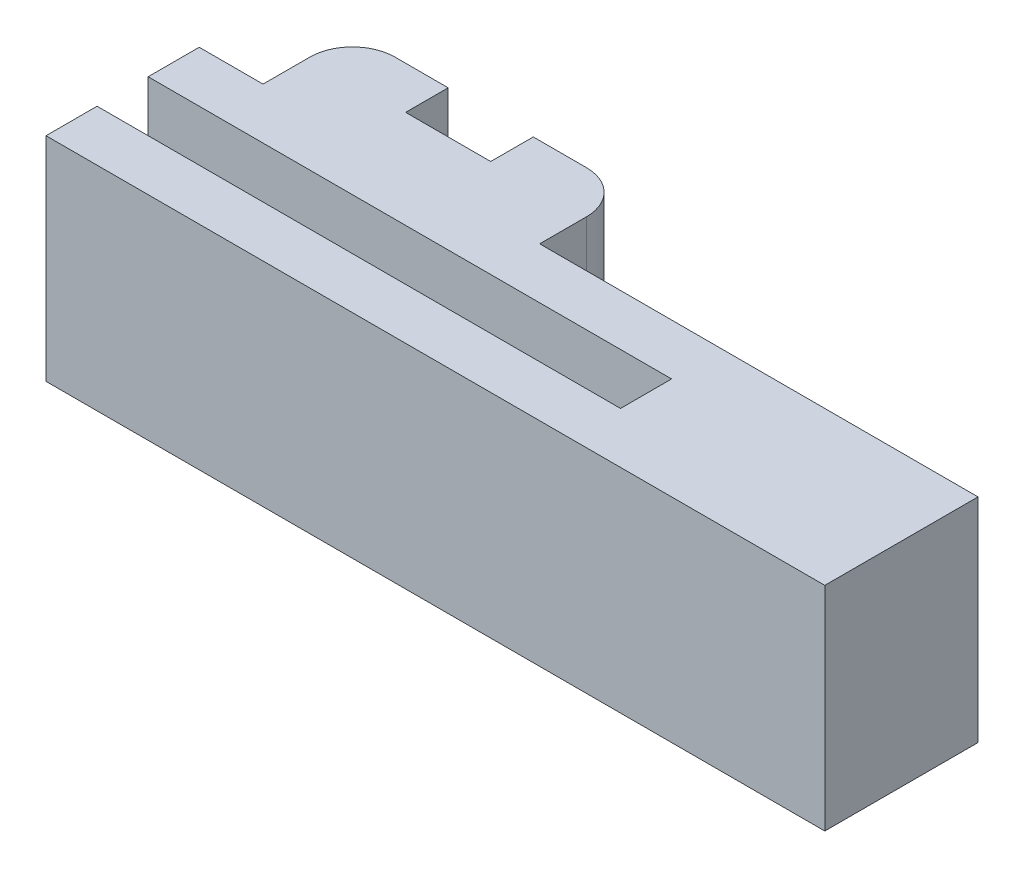
ISO-10303-21;
HEADER;
FILE_DESCRIPTION(('STEP AP214'),'2;1');
FILE_NAME('part.step','',(''),(''),'','','');
FILE_SCHEMA(('AUTOMOTIVE_DESIGN { 1 0 10303 214 1 1 1 1 }'));
ENDSEC;
DATA;
#1=APPLICATION_CONTEXT('core data for automotive mechanical design processes');
#2=APPLICATION_PROTOCOL_DEFINITION('international standard','automotive_design',2000,#1);
#3=PRODUCT_CONTEXT('',#1,'mechanical');
#4=PRODUCT('Part','Part','',(#3));
#5=PRODUCT_RELATED_PRODUCT_CATEGORY('part','',(#4));
#6=PRODUCT_DEFINITION_FORMATION('','',#4);
#7=PRODUCT_DEFINITION_CONTEXT('part definition',#1,'design');
#8=PRODUCT_DEFINITION('design','',#6,#7);
#9=PRODUCT_DEFINITION_SHAPE('','',#8);
#10=(LENGTH_UNIT() NAMED_UNIT(*) SI_UNIT(.MILLI.,.METRE.));
#11=(NAMED_UNIT(*) PLANE_ANGLE_UNIT() SI_UNIT($,.RADIAN.));
#12=(NAMED_UNIT(*) SI_UNIT($,.STERADIAN.) SOLID_ANGLE_UNIT());
#13=UNCERTAINTY_MEASURE_WITH_UNIT(LENGTH_MEASURE(1.E-05),#10,'distance_accuracy_value','');
#14=(GEOMETRIC_REPRESENTATION_CONTEXT(3) GLOBAL_UNCERTAINTY_ASSIGNED_CONTEXT((#13)) GLOBAL_UNIT_ASSIGNED_CONTEXT((#10,
#11,#12)) REPRESENTATION_CONTEXT('',''));
#15=CARTESIAN_POINT('',(0.,0.,0.));
#16=DIRECTION('',(0.,0.,1.));
#17=DIRECTION('',(1.,0.,0.));
#18=AXIS2_PLACEMENT_3D('',#15,#16,#17);
#19=CARTESIAN_POINT('',(-14.5036363636364,5.,-2.06181818181818));
#20=DIRECTION('',(1.,0.,0.));
#21=DIRECTION('',(0.,0.,-1.));
#22=AXIS2_PLACEMENT_3D('',#19,#20,#21);
#23=PLANE('',#22);
#24=DIRECTION('',(0.,0.,1.));
#25=VECTOR('',#24,1.);
#26=CARTESIAN_POINT('',(-14.5036363636364,0.,-2.06181818181818));
#27=LINE('',#26,#25);
#28=CARTESIAN_POINT('',(-14.5036363636364,0.,-2.06181818181818));
#29=VERTEX_POINT('',#28);
#30=CARTESIAN_POINT('',(-14.5036363636364,0.,-0.861818181818182));
#31=VERTEX_POINT('',#30);
#32=EDGE_CURVE('E192',#29,#31,#27,.T.);
#33=ORIENTED_EDGE('',*,*,#32,.T.);
#34=DIRECTION('',(0.,-1.,0.));
#35=VECTOR('',#34,1.);
#36=CARTESIAN_POINT('',(-14.5036363636364,5.,-0.861818181818182));
#37=LINE('',#36,#35);
#38=CARTESIAN_POINT('',(-14.5036363636364,5.,-0.861818181818182));
#39=VERTEX_POINT('',#38);
#40=EDGE_CURVE('E173',#39,#31,#37,.T.);
#41=ORIENTED_EDGE('',*,*,#40,.F.);
#42=DIRECTION('',(0.,0.,1.));
#43=VECTOR('',#42,1.);
#44=CARTESIAN_POINT('',(-14.5036363636364,5.,-2.06181818181818));
#45=LINE('',#44,#43);
#46=CARTESIAN_POINT('',(-14.5036363636364,5.,-2.06181818181818));
#47=VERTEX_POINT('',#46);
#48=EDGE_CURVE('E179',#47,#39,#45,.T.);
#49=ORIENTED_EDGE('',*,*,#48,.F.);
#50=DIRECTION('',(0.,-1.,0.));
#51=VECTOR('',#50,1.);
#52=CARTESIAN_POINT('',(-14.5036363636364,5.,-2.06181818181818));
#53=LINE('',#52,#51);
#54=EDGE_CURVE('E234',#47,#29,#53,.T.);
#55=ORIENTED_EDGE('',*,*,#54,.T.);
#56=EDGE_LOOP('',(#33,#41,#49,#55));
#57=FACE_BOUND('',#56,.T.);
#58=ADVANCED_FACE('F41',(#57),#23,.F.);
#59=CARTESIAN_POINT('',(-14.5036363636364,5.,-0.861818181818182));
#60=DIRECTION('',(0.,0.,-1.));
#61=DIRECTION('',(-1.,0.,0.));
#62=AXIS2_PLACEMENT_3D('',#59,#60,#61);
#63=PLANE('',#62);
#64=DIRECTION('',(1.,0.,0.));
#65=VECTOR('',#64,1.);
#66=CARTESIAN_POINT('',(-14.5036363636364,0.,-0.861818181818182));
#67=LINE('',#66,#65);
#68=CARTESIAN_POINT('',(-2.20363636363636,0.,-0.861818181818182));
#69=VERTEX_POINT('',#68);
#70=EDGE_CURVE('E284',#31,#69,#67,.T.);
#71=ORIENTED_EDGE('',*,*,#70,.T.);
#72=DIRECTION('',(0.,-1.,0.));
#73=VECTOR('',#72,1.);
#74=CARTESIAN_POINT('',(-2.20363636363636,5.,-0.861818181818182));
#75=LINE('',#74,#73);
#76=CARTESIAN_POINT('',(-2.20363636363636,5.,-0.861818181818182));
#77=VERTEX_POINT('',#76);
#78=EDGE_CURVE('E176',#77,#69,#75,.T.);
#79=ORIENTED_EDGE('',*,*,#78,.F.);
#80=DIRECTION('',(1.,0.,0.));
#81=VECTOR('',#80,1.);
#82=CARTESIAN_POINT('',(-14.5036363636364,5.,-0.861818181818182));
#83=LINE('',#82,#81);
#84=EDGE_CURVE('E169',#39,#77,#83,.T.);
#85=ORIENTED_EDGE('',*,*,#84,.F.);
#86=ORIENTED_EDGE('',*,*,#40,.T.);
#87=EDGE_LOOP('',(#71,#79,#85,#86));
#88=FACE_BOUND('',#87,.T.);
#89=ADVANCED_FACE('F171',(#88),#63,.F.);
#90=CARTESIAN_POINT('',(-2.20363636363636,5.,-0.861818181818182));
#91=DIRECTION('',(1.,0.,0.));
#92=DIRECTION('',(0.,0.,-1.));
#93=AXIS2_PLACEMENT_3D('',#90,#91,#92);
#94=PLANE('',#93);
#95=DIRECTION('',(0.,0.,1.));
#96=VECTOR('',#95,1.);
#97=CARTESIAN_POINT('',(-2.20363636363636,0.,-0.861818181818182));
#98=LINE('',#97,#96);
#99=CARTESIAN_POINT('',(-2.20363636363636,0.,0.338181818181818));
#100=VERTEX_POINT('',#99);
#101=EDGE_CURVE('E278',#69,#100,#98,.T.);
#102=ORIENTED_EDGE('',*,*,#101,.T.);
#103=DIRECTION('',(0.,-1.,0.));
#104=VECTOR('',#103,1.);
#105=CARTESIAN_POINT('',(-2.20363636363636,5.,0.338181818181818));
#106=LINE('',#105,#104);
#107=CARTESIAN_POINT('',(-2.20363636363636,5.,0.338181818181818));
#108=VERTEX_POINT('',#107);
#109=EDGE_CURVE('E198',#108,#100,#106,.T.);
#110=ORIENTED_EDGE('',*,*,#109,.F.);
#111=DIRECTION('',(0.,0.,1.));
#112=VECTOR('',#111,1.);
#113=CARTESIAN_POINT('',(-2.20363636363636,5.,-0.861818181818182));
#114=LINE('',#113,#112);
#115=EDGE_CURVE('E178',#77,#108,#114,.T.);
#116=ORIENTED_EDGE('',*,*,#115,.F.);
#117=ORIENTED_EDGE('',*,*,#78,.T.);
#118=EDGE_LOOP('',(#102,#110,#116,#117));
#119=FACE_BOUND('',#118,.T.);
#120=ADVANCED_FACE('F321',(#119),#94,.F.);
#121=CARTESIAN_POINT('',(-14.5036363636364,5.,0.338181818181818));
#122=DIRECTION('',(0.,0.,1.));
#123=DIRECTION('',(1.,0.,0.));
#124=AXIS2_PLACEMENT_3D('',#121,#122,#123);
#125=PLANE('',#124);
#126=DIRECTION('',(-1.,0.,0.));
#127=VECTOR('',#126,1.);
#128=CARTESIAN_POINT('',(-14.5036363636364,0.,0.338181818181818));
#129=LINE('',#128,#127);
#130=CARTESIAN_POINT('',(-14.5036363636364,0.,0.338181818181818));
#131=VERTEX_POINT('',#130);
#132=EDGE_CURVE('E273',#100,#131,#129,.T.);
#133=ORIENTED_EDGE('',*,*,#132,.T.);
#134=DIRECTION('',(0.,-1.,0.));
#135=VECTOR('',#134,1.);
#136=CARTESIAN_POINT('',(-14.5036363636364,5.,0.338181818181818));
#137=LINE('',#136,#135);
#138=CARTESIAN_POINT('',(-14.5036363636364,5.,0.338181818181818));
#139=VERTEX_POINT('',#138);
#140=EDGE_CURVE('E264',#139,#131,#137,.T.);
#141=ORIENTED_EDGE('',*,*,#140,.F.);
#142=DIRECTION('',(-1.,0.,0.));
#143=VECTOR('',#142,1.);
#144=CARTESIAN_POINT('',(-14.5036363636364,5.,0.338181818181818));
#145=LINE('',#144,#143);
#146=EDGE_CURVE('E274',#108,#139,#145,.T.);
#147=ORIENTED_EDGE('',*,*,#146,.F.);
#148=ORIENTED_EDGE('',*,*,#109,.T.);
#149=EDGE_LOOP('',(#133,#141,#147,#148));
#150=FACE_BOUND('',#149,.T.);
#151=ADVANCED_FACE('F271',(#150),#125,.F.);
#152=CARTESIAN_POINT('',(-14.5036363636364,5.,0.338181818181818));
#153=DIRECTION('',(1.,0.,0.));
#154=DIRECTION('',(0.,0.,-1.));
#155=AXIS2_PLACEMENT_3D('',#152,#153,#154);
#156=PLANE('',#155);
#157=DIRECTION('',(0.,0.,1.));
#158=VECTOR('',#157,1.);
#159=CARTESIAN_POINT('',(-14.5036363636364,0.,0.338181818181818));
#160=LINE('',#159,#158);
#161=CARTESIAN_POINT('',(-14.5036363636364,0.,1.53818181818182));
#162=VERTEX_POINT('',#161);
#163=EDGE_CURVE('E280',#131,#162,#160,.T.);
#164=ORIENTED_EDGE('',*,*,#163,.T.);
#165=DIRECTION('',(0.,-1.,0.));
#166=VECTOR('',#165,1.);
#167=CARTESIAN_POINT('',(-14.5036363636364,5.,1.53818181818182));
#168=LINE('',#167,#166);
#169=CARTESIAN_POINT('',(-14.5036363636364,5.,1.53818181818182));
#170=VERTEX_POINT('',#169);
#171=EDGE_CURVE('E261',#170,#162,#168,.T.);
#172=ORIENTED_EDGE('',*,*,#171,.F.);
#173=DIRECTION('',(0.,0.,1.));
#174=VECTOR('',#173,1.);
#175=CARTESIAN_POINT('',(-14.5036363636364,5.,0.338181818181818));
#176=LINE('',#175,#174);
#177=EDGE_CURVE('E323',#139,#170,#176,.T.);
#178=ORIENTED_EDGE('',*,*,#177,.F.);
#179=ORIENTED_EDGE('',*,*,#140,.T.);
#180=EDGE_LOOP('',(#164,#172,#178,#179));
#181=FACE_BOUND('',#180,.T.);
#182=ADVANCED_FACE('F379',(#181),#156,.F.);
#183=CARTESIAN_POINT('',(-14.5036363636364,5.,1.53818181818182));
#184=DIRECTION('',(0.,0.,-1.));
#185=DIRECTION('',(-1.,0.,0.));
#186=AXIS2_PLACEMENT_3D('',#183,#184,#185);
#187=PLANE('',#186);
#188=DIRECTION('',(1.,0.,0.));
#189=VECTOR('',#188,1.);
#190=CARTESIAN_POINT('',(-14.5036363636364,0.,1.53818181818182));
#191=LINE('',#190,#189);
#192=CARTESIAN_POINT('',(3.79636363636364,0.,1.53818181818182));
#193=VERTEX_POINT('',#192);
#194=EDGE_CURVE('E282',#162,#193,#191,.T.);
#195=ORIENTED_EDGE('',*,*,#194,.T.);
#196=DIRECTION('',(0.,-1.,0.));
#197=VECTOR('',#196,1.);
#198=CARTESIAN_POINT('',(3.79636363636364,5.,1.53818181818182));
#199=LINE('',#198,#197);
#200=CARTESIAN_POINT('',(3.79636363636364,5.,1.53818181818182));
#201=VERTEX_POINT('',#200);
#202=EDGE_CURVE('E258',#201,#193,#199,.T.);
#203=ORIENTED_EDGE('',*,*,#202,.F.);
#204=DIRECTION('',(1.,0.,0.));
#205=VECTOR('',#204,1.);
#206=CARTESIAN_POINT('',(-14.5036363636364,5.,1.53818181818182));
#207=LINE('',#206,#205);
#208=EDGE_CURVE('E327',#170,#201,#207,.T.);
#209=ORIENTED_EDGE('',*,*,#208,.F.);
#210=ORIENTED_EDGE('',*,*,#171,.T.);
#211=EDGE_LOOP('',(#195,#203,#209,#210));
#212=FACE_BOUND('',#211,.T.);
#213=ADVANCED_FACE('F375',(#212),#187,.F.);
#214=CARTESIAN_POINT('',(3.79636363636364,5.,-2.06181818181818));
#215=DIRECTION('',(-1.,0.,0.));
#216=DIRECTION('',(0.,0.,1.));
#217=AXIS2_PLACEMENT_3D('',#214,#215,#216);
#218=PLANE('',#217);
#219=DIRECTION('',(0.,0.,-1.));
#220=VECTOR('',#219,1.);
#221=CARTESIAN_POINT('',(3.79636363636364,0.,-2.06181818181818));
#222=LINE('',#221,#220);
#223=CARTESIAN_POINT('',(3.79636363636364,0.,-2.06181818181818));
#224=VERTEX_POINT('',#223);
#225=EDGE_CURVE('E289',#193,#224,#222,.T.);
#226=ORIENTED_EDGE('',*,*,#225,.T.);
#227=DIRECTION('',(0.,-1.,0.));
#228=VECTOR('',#227,1.);
#229=CARTESIAN_POINT('',(3.79636363636364,5.,-2.06181818181818));
#230=LINE('',#229,#228);
#231=CARTESIAN_POINT('',(3.79636363636364,5.,-2.06181818181818));
#232=VERTEX_POINT('',#231);
#233=EDGE_CURVE('E255',#232,#224,#230,.T.);
#234=ORIENTED_EDGE('',*,*,#233,.F.);
#235=DIRECTION('',(0.,0.,-1.));
#236=VECTOR('',#235,1.);
#237=CARTESIAN_POINT('',(3.79636363636364,5.,-2.06181818181818));
#238=LINE('',#237,#236);
#239=EDGE_CURVE('E329',#201,#232,#238,.T.);
#240=ORIENTED_EDGE('',*,*,#239,.F.);
#241=ORIENTED_EDGE('',*,*,#202,.T.);
#242=EDGE_LOOP('',(#226,#234,#240,#241));
#243=FACE_BOUND('',#242,.T.);
#244=ADVANCED_FACE('F370',(#243),#218,.F.);
#245=CARTESIAN_POINT('',(-6.50363636363636,5.,-2.06181818181818));
#246=DIRECTION('',(0.,0.,1.));
#247=DIRECTION('',(1.,0.,0.));
#248=AXIS2_PLACEMENT_3D('',#245,#246,#247);
#249=PLANE('',#248);
#250=DIRECTION('',(-1.,0.,0.));
#251=VECTOR('',#250,1.);
#252=CARTESIAN_POINT('',(-6.50363636363636,0.,-2.06181818181818));
#253=LINE('',#252,#251);
#254=CARTESIAN_POINT('',(-6.50363636363636,0.,-2.06181818181818));
#255=VERTEX_POINT('',#254);
#256=EDGE_CURVE('E291',#224,#255,#253,.T.);
#257=ORIENTED_EDGE('',*,*,#256,.T.);
#258=DIRECTION('',(0.,-1.,0.));
#259=VECTOR('',#258,1.);
#260=CARTESIAN_POINT('',(-6.50363636363636,5.,-2.06181818181818));
#261=LINE('',#260,#259);
#262=CARTESIAN_POINT('',(-6.50363636363636,5.,-2.06181818181818));
#263=VERTEX_POINT('',#262);
#264=EDGE_CURVE('E251',#263,#255,#261,.T.);
#265=ORIENTED_EDGE('',*,*,#264,.F.);
#266=DIRECTION('',(-1.,0.,0.));
#267=VECTOR('',#266,1.);
#268=CARTESIAN_POINT('',(-6.50363636363636,5.,-2.06181818181818));
#269=LINE('',#268,#267);
#270=EDGE_CURVE('E331',#232,#263,#269,.T.);
#271=ORIENTED_EDGE('',*,*,#270,.F.);
#272=ORIENTED_EDGE('',*,*,#233,.T.);
#273=EDGE_LOOP('',(#257,#265,#271,#272));
#274=FACE_BOUND('',#273,.T.);
#275=ADVANCED_FACE('F366',(#274),#249,.F.);
#276=CARTESIAN_POINT('',(-6.50363636363636,5.,-2.06181818181818));
#277=DIRECTION('',(-1.,0.,0.));
#278=DIRECTION('',(0.,0.,1.));
#279=AXIS2_PLACEMENT_3D('',#276,#277,#278);
#280=PLANE('',#279);
#281=DIRECTION('',(0.,0.,-1.));
#282=VECTOR('',#281,1.);
#283=CARTESIAN_POINT('',(-6.50363636363636,0.,-2.06181818181818));
#284=LINE('',#283,#282);
#285=CARTESIAN_POINT('',(-6.50363636363636,0.,-3.16181818181818));
#286=VERTEX_POINT('',#285);
#287=EDGE_CURVE('E294',#255,#286,#284,.T.);
#288=ORIENTED_EDGE('',*,*,#287,.T.);
#289=DIRECTION('',(0.,-1.,0.));
#290=VECTOR('',#289,1.);
#291=CARTESIAN_POINT('',(-6.50363636363636,5.,-3.16181818181818));
#292=LINE('',#291,#290);
#293=CARTESIAN_POINT('',(-6.50363636363636,5.,-3.16181818181818));
#294=VERTEX_POINT('',#293);
#295=EDGE_CURVE('E206',#286,#294,#292,.F.);
#296=ORIENTED_EDGE('',*,*,#295,.T.);
#297=DIRECTION('',(0.,0.,-1.));
#298=VECTOR('',#297,1.);
#299=CARTESIAN_POINT('',(-6.50363636363636,5.,-2.06181818181818));
#300=LINE('',#299,#298);
#301=EDGE_CURVE('E334',#263,#294,#300,.T.);
#302=ORIENTED_EDGE('',*,*,#301,.F.);
#303=ORIENTED_EDGE('',*,*,#264,.T.);
#304=EDGE_LOOP('',(#288,#296,#302,#303));
#305=FACE_BOUND('',#304,.T.);
#306=ADVANCED_FACE('F361',(#305),#280,.F.);
#307=CARTESIAN_POINT('',(-8.75363636363636,5.,-4.16181818181818));
#308=DIRECTION('',(0.,0.,1.));
#309=DIRECTION('',(1.,0.,0.));
#310=AXIS2_PLACEMENT_3D('',#307,#308,#309);
#311=PLANE('',#310);
#312=DIRECTION('',(-1.,0.,0.));
#313=VECTOR('',#312,1.);
#314=CARTESIAN_POINT('',(-8.75363636363636,5.,-4.16181818181818));
#315=LINE('',#314,#313);
#316=CARTESIAN_POINT('',(-7.50363636363636,5.,-4.16181818181818));
#317=VERTEX_POINT('',#316);
#318=CARTESIAN_POINT('',(-8.75363636363636,5.,-4.16181818181818));
#319=VERTEX_POINT('',#318);
#320=EDGE_CURVE('E337',#317,#319,#315,.T.);
#321=ORIENTED_EDGE('',*,*,#320,.F.);
#322=DIRECTION('',(0.,-1.,0.));
#323=VECTOR('',#322,1.);
#324=CARTESIAN_POINT('',(-7.50363636363636,5.,-4.16181818181818));
#325=LINE('',#324,#323);
#326=CARTESIAN_POINT('',(-7.50363636363636,0.,-4.16181818181818));
#327=VERTEX_POINT('',#326);
#328=EDGE_CURVE('E193',#317,#327,#325,.T.);
#329=ORIENTED_EDGE('',*,*,#328,.T.);
#330=DIRECTION('',(-1.,0.,0.));
#331=VECTOR('',#330,1.);
#332=CARTESIAN_POINT('',(-8.75363636363636,0.,-4.16181818181818));
#333=LINE('',#332,#331);
#334=CARTESIAN_POINT('',(-8.75363636363636,0.,-4.16181818181818));
#335=VERTEX_POINT('',#334);
#336=EDGE_CURVE('E297',#327,#335,#333,.T.);
#337=ORIENTED_EDGE('',*,*,#336,.T.);
#338=DIRECTION('',(0.,-1.,0.));
#339=VECTOR('',#338,1.);
#340=CARTESIAN_POINT('',(-8.75363636363636,5.,-4.16181818181818));
#341=LINE('',#340,#339);
#342=EDGE_CURVE('E248',#319,#335,#341,.T.);
#343=ORIENTED_EDGE('',*,*,#342,.F.);
#344=EDGE_LOOP('',(#321,#329,#337,#343));
#345=FACE_BOUND('',#344,.T.);
#346=ADVANCED_FACE('F352',(#345),#311,.F.);
#347=CARTESIAN_POINT('',(-8.75363636363636,5.,-4.16181818181818));
#348=DIRECTION('',(1.,0.,0.));
#349=DIRECTION('',(0.,0.,-1.));
#350=AXIS2_PLACEMENT_3D('',#347,#348,#349);
#351=PLANE('',#350);
#352=DIRECTION('',(0.,0.,1.));
#353=VECTOR('',#352,1.);
#354=CARTESIAN_POINT('',(-8.75363636363636,0.,-4.16181818181818));
#355=LINE('',#354,#353);
#356=CARTESIAN_POINT('',(-8.75363636363636,0.,-3.16181818181818));
#357=VERTEX_POINT('',#356);
#358=EDGE_CURVE('E299',#335,#357,#355,.T.);
#359=ORIENTED_EDGE('',*,*,#358,.T.);
#360=DIRECTION('',(0.,-1.,0.));
#361=VECTOR('',#360,1.);
#362=CARTESIAN_POINT('',(-8.75363636363636,5.,-3.16181818181818));
#363=LINE('',#362,#361);
#364=CARTESIAN_POINT('',(-8.75363636363636,5.,-3.16181818181818));
#365=VERTEX_POINT('',#364);
#366=EDGE_CURVE('E245',#365,#357,#363,.T.);
#367=ORIENTED_EDGE('',*,*,#366,.F.);
#368=DIRECTION('',(0.,0.,1.));
#369=VECTOR('',#368,1.);
#370=CARTESIAN_POINT('',(-8.75363636363636,5.,-4.16181818181818));
#371=LINE('',#370,#369);
#372=EDGE_CURVE('E339',#319,#365,#371,.T.);
#373=ORIENTED_EDGE('',*,*,#372,.F.);
#374=ORIENTED_EDGE('',*,*,#342,.T.);
#375=EDGE_LOOP('',(#359,#367,#373,#374));
#376=FACE_BOUND('',#375,.T.);
#377=ADVANCED_FACE('F348',(#376),#351,.F.);
#378=CARTESIAN_POINT('',(-10.7536363636364,5.,-3.16181818181818));
#379=DIRECTION('',(0.,0.,1.));
#380=DIRECTION('',(1.,0.,0.));
#381=AXIS2_PLACEMENT_3D('',#378,#379,#380);
#382=PLANE('',#381);
#383=DIRECTION('',(-1.,0.,0.));
#384=VECTOR('',#383,1.);
#385=CARTESIAN_POINT('',(-10.7536363636364,0.,-3.16181818181818));
#386=LINE('',#385,#384);
#387=CARTESIAN_POINT('',(-10.7536363636364,0.,-3.16181818181818));
#388=VERTEX_POINT('',#387);
#389=EDGE_CURVE('E301',#357,#388,#386,.T.);
#390=ORIENTED_EDGE('',*,*,#389,.T.);
#391=DIRECTION('',(0.,-1.,0.));
#392=VECTOR('',#391,1.);
#393=CARTESIAN_POINT('',(-10.7536363636364,5.,-3.16181818181818));
#394=LINE('',#393,#392);
#395=CARTESIAN_POINT('',(-10.7536363636364,5.,-3.16181818181818));
#396=VERTEX_POINT('',#395);
#397=EDGE_CURVE('E241',#396,#388,#394,.T.);
#398=ORIENTED_EDGE('',*,*,#397,.F.);
#399=DIRECTION('',(-1.,0.,0.));
#400=VECTOR('',#399,1.);
#401=CARTESIAN_POINT('',(-10.7536363636364,5.,-3.16181818181818));
#402=LINE('',#401,#400);
#403=EDGE_CURVE('E316',#365,#396,#402,.T.);
#404=ORIENTED_EDGE('',*,*,#403,.F.);
#405=ORIENTED_EDGE('',*,*,#366,.T.);
#406=EDGE_LOOP('',(#390,#398,#404,#405));
#407=FACE_BOUND('',#406,.T.);
#408=ADVANCED_FACE('F345',(#407),#382,.F.);
#409=CARTESIAN_POINT('',(-10.7536363636364,5.,-4.16181818181818));
#410=DIRECTION('',(-1.,0.,0.));
#411=DIRECTION('',(0.,0.,1.));
#412=AXIS2_PLACEMENT_3D('',#409,#410,#411);
#413=PLANE('',#412);
#414=DIRECTION('',(0.,0.,-1.));
#415=VECTOR('',#414,1.);
#416=CARTESIAN_POINT('',(-10.7536363636364,0.,-4.16181818181818));
#417=LINE('',#416,#415);
#418=CARTESIAN_POINT('',(-10.7536363636364,0.,-4.16181818181818));
#419=VERTEX_POINT('',#418);
#420=EDGE_CURVE('E230',#388,#419,#417,.T.);
#421=ORIENTED_EDGE('',*,*,#420,.T.);
#422=DIRECTION('',(0.,-1.,0.));
#423=VECTOR('',#422,1.);
#424=CARTESIAN_POINT('',(-10.7536363636364,5.,-4.16181818181818));
#425=LINE('',#424,#423);
#426=CARTESIAN_POINT('',(-10.7536363636364,5.,-4.16181818181818));
#427=VERTEX_POINT('',#426);
#428=EDGE_CURVE('E238',#427,#419,#425,.T.);
#429=ORIENTED_EDGE('',*,*,#428,.F.);
#430=DIRECTION('',(0.,0.,-1.));
#431=VECTOR('',#430,1.);
#432=CARTESIAN_POINT('',(-10.7536363636364,5.,-4.16181818181818));
#433=LINE('',#432,#431);
#434=EDGE_CURVE('E312',#396,#427,#433,.T.);
#435=ORIENTED_EDGE('',*,*,#434,.F.);
#436=ORIENTED_EDGE('',*,*,#397,.T.);
#437=EDGE_LOOP('',(#421,#429,#435,#436));
#438=FACE_BOUND('',#437,.T.);
#439=ADVANCED_FACE('F306',(#438),#413,.F.);
#440=CARTESIAN_POINT('',(-13.0036363636364,5.,-4.16181818181818));
#441=DIRECTION('',(0.,0.,1.));
#442=DIRECTION('',(1.,0.,0.));
#443=AXIS2_PLACEMENT_3D('',#440,#441,#442);
#444=PLANE('',#443);
#445=DIRECTION('',(-1.,0.,0.));
#446=VECTOR('',#445,1.);
#447=CARTESIAN_POINT('',(-13.0036363636364,0.,-4.16181818181818));
#448=LINE('',#447,#446);
#449=CARTESIAN_POINT('',(-12.0036363636364,0.,-4.16181818181818));
#450=VERTEX_POINT('',#449);
#451=EDGE_CURVE('E227',#419,#450,#448,.T.);
#452=ORIENTED_EDGE('',*,*,#451,.T.);
#453=DIRECTION('',(0.,-1.,0.));
#454=VECTOR('',#453,1.);
#455=CARTESIAN_POINT('',(-12.0036363636364,5.,-4.16181818181818));
#456=LINE('',#455,#454);
#457=CARTESIAN_POINT('',(-12.0036363636364,5.,-4.16181818181818));
#458=VERTEX_POINT('',#457);
#459=EDGE_CURVE('E11',#450,#458,#456,.F.);
#460=ORIENTED_EDGE('',*,*,#459,.T.);
#461=DIRECTION('',(-1.,0.,0.));
#462=VECTOR('',#461,1.);
#463=CARTESIAN_POINT('',(-13.0036363636364,5.,-4.16181818181818));
#464=LINE('',#463,#462);
#465=EDGE_CURVE('E311',#427,#458,#464,.T.);
#466=ORIENTED_EDGE('',*,*,#465,.F.);
#467=ORIENTED_EDGE('',*,*,#428,.T.);
#468=EDGE_LOOP('',(#452,#460,#466,#467));
#469=FACE_BOUND('',#468,.T.);
#470=ADVANCED_FACE('F310',(#469),#444,.F.);
#471=CARTESIAN_POINT('',(-13.0036363636364,5.,-2.06181818181818));
#472=DIRECTION('',(1.,0.,0.));
#473=DIRECTION('',(0.,0.,-1.));
#474=AXIS2_PLACEMENT_3D('',#471,#472,#473);
#475=PLANE('',#474);
#476=DIRECTION('',(0.,0.,1.));
#477=VECTOR('',#476,1.);
#478=CARTESIAN_POINT('',(-13.0036363636364,5.,-2.06181818181818));
#479=LINE('',#478,#477);
#480=CARTESIAN_POINT('',(-13.0036363636364,5.,-3.16181818181818));
#481=VERTEX_POINT('',#480);
#482=CARTESIAN_POINT('',(-13.0036363636364,5.,-2.06181818181818));
#483=VERTEX_POINT('',#482);
#484=EDGE_CURVE('E220',#481,#483,#479,.T.);
#485=ORIENTED_EDGE('',*,*,#484,.F.);
#486=DIRECTION('',(0.,-1.,0.));
#487=VECTOR('',#486,1.);
#488=CARTESIAN_POINT('',(-13.0036363636364,5.,-3.16181818181818));
#489=LINE('',#488,#487);
#490=CARTESIAN_POINT('',(-13.0036363636364,0.,-3.16181818181818));
#491=VERTEX_POINT('',#490);
#492=EDGE_CURVE('E49',#481,#491,#489,.T.);
#493=ORIENTED_EDGE('',*,*,#492,.T.);
#494=DIRECTION('',(0.,0.,1.));
#495=VECTOR('',#494,1.);
#496=CARTESIAN_POINT('',(-13.0036363636364,0.,-2.06181818181818));
#497=LINE('',#496,#495);
#498=CARTESIAN_POINT('',(-13.0036363636364,0.,-2.06181818181818));
#499=VERTEX_POINT('',#498);
#500=EDGE_CURVE('E218',#491,#499,#497,.T.);
#501=ORIENTED_EDGE('',*,*,#500,.T.);
#502=DIRECTION('',(0.,-1.,0.));
#503=VECTOR('',#502,1.);
#504=CARTESIAN_POINT('',(-13.0036363636364,5.,-2.06181818181818));
#505=LINE('',#504,#503);
#506=EDGE_CURVE('E236',#483,#499,#505,.T.);
#507=ORIENTED_EDGE('',*,*,#506,.F.);
#508=EDGE_LOOP('',(#485,#493,#501,#507));
#509=FACE_BOUND('',#508,.T.);
#510=ADVANCED_FACE('F216',(#509),#475,.F.);
#511=CARTESIAN_POINT('',(-14.5036363636364,5.,-2.06181818181818));
#512=DIRECTION('',(0.,0.,1.));
#513=DIRECTION('',(1.,0.,0.));
#514=AXIS2_PLACEMENT_3D('',#511,#512,#513);
#515=PLANE('',#514);
#516=DIRECTION('',(-1.,0.,0.));
#517=VECTOR('',#516,1.);
#518=CARTESIAN_POINT('',(-14.5036363636364,0.,-2.06181818181818));
#519=LINE('',#518,#517);
#520=EDGE_CURVE('E189',#499,#29,#519,.T.);
#521=ORIENTED_EDGE('',*,*,#520,.T.);
#522=ORIENTED_EDGE('',*,*,#54,.F.);
#523=DIRECTION('',(-1.,0.,0.));
#524=VECTOR('',#523,1.);
#525=CARTESIAN_POINT('',(-14.5036363636364,5.,-2.06181818181818));
#526=LINE('',#525,#524);
#527=EDGE_CURVE('E185',#483,#47,#526,.T.);
#528=ORIENTED_EDGE('',*,*,#527,.F.);
#529=ORIENTED_EDGE('',*,*,#506,.T.);
#530=EDGE_LOOP('',(#521,#522,#528,#529));
#531=FACE_BOUND('',#530,.T.);
#532=ADVANCED_FACE('F404',(#531),#515,.F.);
#533=CARTESIAN_POINT('',(0.,5.,0.));
#534=DIRECTION('',(0.,1.,0.));
#535=DIRECTION('',(0.,0.,1.));
#536=AXIS2_PLACEMENT_3D('',#533,#534,#535);
#537=PLANE('',#536);
#538=ORIENTED_EDGE('',*,*,#301,.T.);
#539=CARTESIAN_POINT('',(-7.50363636363636,5.,-3.16181818181818));
#540=DIRECTION('',(0.,1.,0.));
#541=DIRECTION('',(0.,0.,1.));
#542=AXIS2_PLACEMENT_3D('',#539,#540,#541);
#543=CIRCLE('',#542,1.);
#544=EDGE_CURVE('E209',#294,#317,#543,.T.);
#545=ORIENTED_EDGE('',*,*,#544,.T.);
#546=ORIENTED_EDGE('',*,*,#320,.T.);
#547=ORIENTED_EDGE('',*,*,#372,.T.);
#548=ORIENTED_EDGE('',*,*,#403,.T.);
#549=ORIENTED_EDGE('',*,*,#434,.T.);
#550=ORIENTED_EDGE('',*,*,#465,.T.);
#551=CARTESIAN_POINT('',(-12.0036363636364,5.,-3.16181818181818));
#552=DIRECTION('',(0.,1.,0.));
#553=DIRECTION('',(0.,0.,1.));
#554=AXIS2_PLACEMENT_3D('',#551,#552,#553);
#555=CIRCLE('',#554,1.);
#556=EDGE_CURVE('E56',#458,#481,#555,.T.);
#557=ORIENTED_EDGE('',*,*,#556,.T.);
#558=ORIENTED_EDGE('',*,*,#484,.T.);
#559=ORIENTED_EDGE('',*,*,#527,.T.);
#560=ORIENTED_EDGE('',*,*,#48,.T.);
#561=ORIENTED_EDGE('',*,*,#84,.T.);
#562=ORIENTED_EDGE('',*,*,#115,.T.);
#563=ORIENTED_EDGE('',*,*,#146,.T.);
#564=ORIENTED_EDGE('',*,*,#177,.T.);
#565=ORIENTED_EDGE('',*,*,#208,.T.);
#566=ORIENTED_EDGE('',*,*,#239,.T.);
#567=ORIENTED_EDGE('',*,*,#270,.T.);
#568=EDGE_LOOP('',(#538,#545,#546,#547,#548,#549,#550,#557,#558,#559,#560,#561,#562,#563,#564,
#565,#566,#567));
#569=FACE_BOUND('',#568,.T.);
#570=ADVANCED_FACE('F183',(#569),#537,.T.);
#571=CARTESIAN_POINT('',(0.,0.,0.));
#572=DIRECTION('',(0.,1.,0.));
#573=DIRECTION('',(0.,0.,1.));
#574=AXIS2_PLACEMENT_3D('',#571,#572,#573);
#575=PLANE('',#574);
#576=ORIENTED_EDGE('',*,*,#336,.F.);
#577=CARTESIAN_POINT('',(-7.50363636363636,0.,-3.16181818181818));
#578=DIRECTION('',(0.,1.,0.));
#579=DIRECTION('',(0.,0.,1.));
#580=AXIS2_PLACEMENT_3D('',#577,#578,#579);
#581=CIRCLE('',#580,1.);
#582=EDGE_CURVE('E204',#327,#286,#581,.F.);
#583=ORIENTED_EDGE('',*,*,#582,.T.);
#584=ORIENTED_EDGE('',*,*,#287,.F.);
#585=ORIENTED_EDGE('',*,*,#256,.F.);
#586=ORIENTED_EDGE('',*,*,#225,.F.);
#587=ORIENTED_EDGE('',*,*,#194,.F.);
#588=ORIENTED_EDGE('',*,*,#163,.F.);
#589=ORIENTED_EDGE('',*,*,#132,.F.);
#590=ORIENTED_EDGE('',*,*,#101,.F.);
#591=ORIENTED_EDGE('',*,*,#70,.F.);
#592=ORIENTED_EDGE('',*,*,#32,.F.);
#593=ORIENTED_EDGE('',*,*,#520,.F.);
#594=ORIENTED_EDGE('',*,*,#500,.F.);
#595=CARTESIAN_POINT('',(-12.0036363636364,0.,-3.16181818181818));
#596=DIRECTION('',(0.,1.,0.));
#597=DIRECTION('',(0.,0.,1.));
#598=AXIS2_PLACEMENT_3D('',#595,#596,#597);
#599=CIRCLE('',#598,1.);
#600=EDGE_CURVE('E196',#491,#450,#599,.F.);
#601=ORIENTED_EDGE('',*,*,#600,.T.);
#602=ORIENTED_EDGE('',*,*,#451,.F.);
#603=ORIENTED_EDGE('',*,*,#420,.F.);
#604=ORIENTED_EDGE('',*,*,#389,.F.);
#605=ORIENTED_EDGE('',*,*,#358,.F.);
#606=EDGE_LOOP('',(#576,#583,#584,#585,#586,#587,#588,#589,#590,#591,#592,#593,#594,#601,#602,
#603,#604,#605));
#607=FACE_BOUND('',#606,.T.);
#608=ADVANCED_FACE('F225',(#607),#575,.F.);
#609=CARTESIAN_POINT('',(-7.50363636363636,5.,-3.16181818181818));
#610=DIRECTION('',(0.,-1.,0.));
#611=DIRECTION('',(0.,0.,-1.));
#612=AXIS2_PLACEMENT_3D('',#609,#610,#611);
#613=CYLINDRICAL_SURFACE('',#612,1.);
#614=ORIENTED_EDGE('',*,*,#544,.F.);
#615=ORIENTED_EDGE('',*,*,#295,.F.);
#616=ORIENTED_EDGE('',*,*,#582,.F.);
#617=ORIENTED_EDGE('',*,*,#328,.F.);
#618=EDGE_LOOP('',(#614,#615,#616,#617));
#619=FACE_BOUND('',#618,.T.);
#620=ADVANCED_FACE('F356',(#619),#613,.T.);
#621=CARTESIAN_POINT('',(-12.0036363636364,5.,-3.16181818181818));
#622=DIRECTION('',(0.,-1.,0.));
#623=DIRECTION('',(0.,0.,-1.));
#624=AXIS2_PLACEMENT_3D('',#621,#622,#623);
#625=CYLINDRICAL_SURFACE('',#624,1.);
#626=ORIENTED_EDGE('',*,*,#556,.F.);
#627=ORIENTED_EDGE('',*,*,#459,.F.);
#628=ORIENTED_EDGE('',*,*,#600,.F.);
#629=ORIENTED_EDGE('',*,*,#492,.F.);
#630=EDGE_LOOP('',(#626,#627,#628,#629));
#631=FACE_BOUND('',#630,.T.);
#632=ADVANCED_FACE('F43',(#631),#625,.T.);
#633=CLOSED_SHELL('',(#58,#89,#120,#151,#182,#213,#244,#275,#306,#346,#377,#408,#439,#470,#510,
#532,#570,#608,#620,#632));
#634=MANIFOLD_SOLID_BREP('B2',#633);
#635=ADVANCED_BREP_SHAPE_REPRESENTATION('',(#18,#634),#14);
#636=SHAPE_DEFINITION_REPRESENTATION(#9,#635);
ENDSEC;
END-ISO-10303-21;
